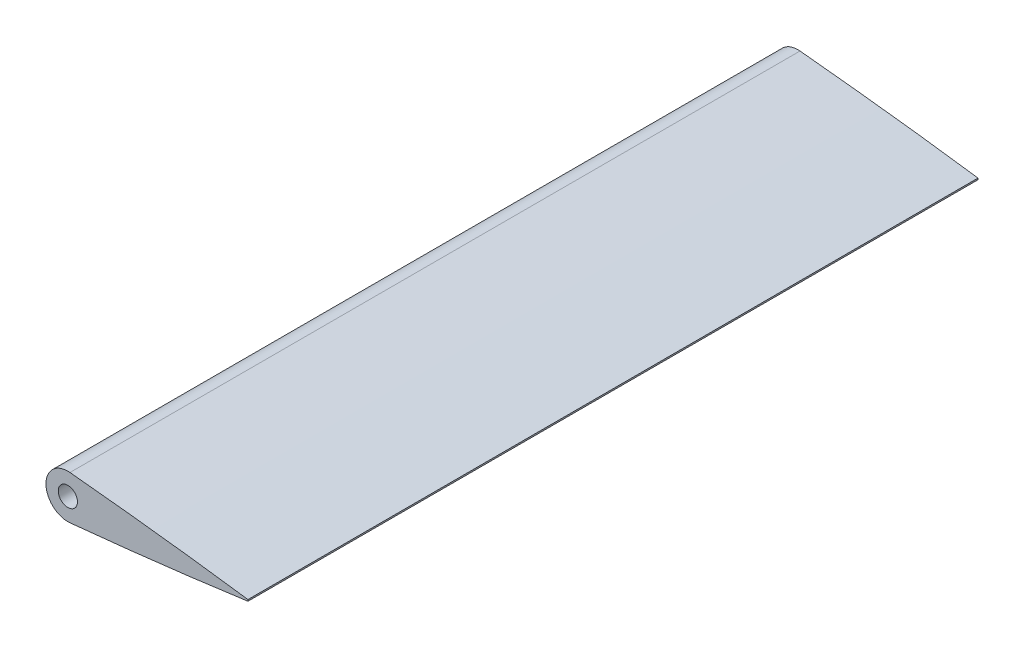
ISO-10303-21;
HEADER;
FILE_DESCRIPTION(('STEP AP214'),'2;1');
FILE_NAME('part.step','',(''),(''),'','','');
FILE_SCHEMA(('AUTOMOTIVE_DESIGN { 1 0 10303 214 1 1 1 1 }'));
ENDSEC;
DATA;
#1=APPLICATION_CONTEXT('core data for automotive mechanical design processes');
#2=APPLICATION_PROTOCOL_DEFINITION('international standard','automotive_design',2000,#1);
#3=PRODUCT_CONTEXT('',#1,'mechanical');
#4=PRODUCT('Part','Part','',(#3));
#5=PRODUCT_RELATED_PRODUCT_CATEGORY('part','',(#4));
#6=PRODUCT_DEFINITION_FORMATION('','',#4);
#7=PRODUCT_DEFINITION_CONTEXT('part definition',#1,'design');
#8=PRODUCT_DEFINITION('design','',#6,#7);
#9=PRODUCT_DEFINITION_SHAPE('','',#8);
#10=(LENGTH_UNIT() NAMED_UNIT(*) SI_UNIT(.MILLI.,.METRE.));
#11=(NAMED_UNIT(*) PLANE_ANGLE_UNIT() SI_UNIT($,.RADIAN.));
#12=(NAMED_UNIT(*) SI_UNIT($,.STERADIAN.) SOLID_ANGLE_UNIT());
#13=UNCERTAINTY_MEASURE_WITH_UNIT(LENGTH_MEASURE(1.E-05),#10,'distance_accuracy_value','');
#14=(GEOMETRIC_REPRESENTATION_CONTEXT(3) GLOBAL_UNCERTAINTY_ASSIGNED_CONTEXT((#13)) GLOBAL_UNIT_ASSIGNED_CONTEXT((#10,
#11,#12)) REPRESENTATION_CONTEXT('',''));
#15=CARTESIAN_POINT('',(0.,0.,0.));
#16=DIRECTION('',(0.,0.,1.));
#17=DIRECTION('',(1.,0.,0.));
#18=AXIS2_PLACEMENT_3D('',#15,#16,#17);
#19=CARTESIAN_POINT('',(175.,0.,0.));
#20=DIRECTION('',(1.,0.,0.));
#21=DIRECTION('',(0.,0.,-1.));
#22=AXIS2_PLACEMENT_3D('',#19,#20,#21);
#23=PLANE('',#22);
#24=DIRECTION('',(0.,-1.,0.));
#25=VECTOR('',#24,1.);
#26=CARTESIAN_POINT('',(175.,0.,140.));
#27=LINE('',#26,#25);
#28=CARTESIAN_POINT('',(175.,0.1575,140.));
#29=VERTEX_POINT('',#28);
#30=CARTESIAN_POINT('',(175.,-0.1575,140.));
#31=VERTEX_POINT('',#30);
#32=EDGE_CURVE('E100',#29,#31,#27,.T.);
#33=ORIENTED_EDGE('',*,*,#32,.F.);
#34=DIRECTION('',(0.,0.,-1.));
#35=VECTOR('',#34,1.);
#36=CARTESIAN_POINT('',(175.,0.1575,240.));
#37=LINE('',#36,#35);
#38=CARTESIAN_POINT('',(175.,0.1575,292.));
#39=VERTEX_POINT('',#38);
#40=EDGE_CURVE('E120',#39,#29,#37,.T.);
#41=ORIENTED_EDGE('',*,*,#40,.F.);
#42=CARTESIAN_POINT('',(175.,-0.1575,292.));
#43=DIRECTION('',(0.,1.,0.));
#44=VECTOR('',#43,1.);
#45=LINE('',#42,#44);
#46=CARTESIAN_POINT('',(175.,-0.1575,292.));
#47=VERTEX_POINT('',#46);
#48=EDGE_CURVE('E122',#47,#39,#45,.T.);
#49=ORIENTED_EDGE('',*,*,#48,.F.);
#50=DIRECTION('',(0.,0.,-1.));
#51=VECTOR('',#50,1.);
#52=CARTESIAN_POINT('',(175.,-0.1575,240.));
#53=LINE('',#52,#51);
#54=EDGE_CURVE('E86',#47,#31,#53,.T.);
#55=ORIENTED_EDGE('',*,*,#54,.T.);
#56=EDGE_LOOP('',(#33,#41,#49,#55));
#57=FACE_BOUND('',#56,.T.);
#58=ADVANCED_FACE('F75',(#57),#23,.T.);
#59=CARTESIAN_POINT('',(175.,0.1575,240.));
#60=CARTESIAN_POINT('',(174.975670099291,0.160914041541677,240.));
#61=CARTESIAN_POINT('',(174.878414868244,0.174561174873842,240.));
#62=CARTESIAN_POINT('',(174.659801499766,0.205159821362737,240.));
#63=CARTESIAN_POINT('',(173.814393736801,0.323268736827635,240.));
#64=CARTESIAN_POINT('',(171.971983222291,0.57756760983331,240.));
#65=CARTESIAN_POINT('',(169.804130316729,0.869468667880044,240.));
#66=CARTESIAN_POINT('',(167.798075845039,1.13373410035728,240.));
#67=CARTESIAN_POINT('',(166.331348146716,1.32444060697064,240.));
#68=CARTESIAN_POINT('',(161.322200966069,1.96622627689324,240.));
#69=CARTESIAN_POINT('',(156.013641601383,2.60401694235936,240.));
#70=CARTESIAN_POINT('',(149.576754994477,3.32818055621066,240.));
#71=CARTESIAN_POINT('',(145.376354095397,3.78430734567515,240.));
#72=CARTESIAN_POINT('',(140.114857130425,4.32702320742082,240.));
#73=CARTESIAN_POINT('',(134.595540648365,4.86377712086384,240.));
#74=CARTESIAN_POINT('',(129.857229802635,5.2939236206402,240.));
#75=CARTESIAN_POINT('',(124.980872811101,5.71026282365352,240.));
#76=CARTESIAN_POINT('',(120.0120690147,6.10561671430527,240.));
#77=CARTESIAN_POINT('',(115.012351702912,6.45951784353202,240.));
#78=CARTESIAN_POINT('',(109.989973527845,6.77673440530095,240.));
#79=CARTESIAN_POINT('',(105.979072501825,6.99718633343155,240.));
#80=CARTESIAN_POINT('',(101.986308858488,7.17846278877443,240.));
#81=CARTESIAN_POINT('',(99.0243670944716,7.29258098720803,240.));
#82=CARTESIAN_POINT('',(96.0938852893426,7.38375281774364,240.));
#83=CARTESIAN_POINT('',(93.2017061002433,7.45066565420669,240.));
#84=CARTESIAN_POINT('',(90.354579605028,7.49204060737605,240.));
#85=CARTESIAN_POINT('',(87.5591504088352,7.50675011459953,240.));
#86=CARTESIAN_POINT('',(84.8219466228125,7.49383510245646,240.));
#87=CARTESIAN_POINT('',(82.1493584308855,7.45253307987314,240.));
#88=CARTESIAN_POINT('',(79.5476260757768,7.38217851087511,240.));
#89=CARTESIAN_POINT('',(77.0228185580325,7.28242210028553,240.));
#90=CARTESIAN_POINT('',(74.5808316410772,7.15305057873661,240.));
#91=CARTESIAN_POINT('',(72.2273654371531,6.99404893787144,240.));
#92=CARTESIAN_POINT('',(69.9679051740815,6.80567273838647,240.));
#93=CARTESIAN_POINT('',(67.8077146053811,6.58837012507359,240.));
#94=CARTESIAN_POINT('',(65.7518313717883,6.34273624779991,240.));
#95=CARTESIAN_POINT('',(63.8050294111967,6.06966614435724,240.));
#96=CARTESIAN_POINT('',(61.9718426706377,5.77004523514184,240.));
#97=CARTESIAN_POINT('',(60.2564977921031,5.4451407514127,240.));
#98=CARTESIAN_POINT('',(58.6629613315306,5.09611834089171,240.));
#99=CARTESIAN_POINT('',(57.194862030039,4.72441172867768,240.));
#100=CARTESIAN_POINT('',(55.855529665828,4.33136969665917,240.));
#101=CARTESIAN_POINT('',(54.6479112309722,3.91848367818142,240.));
#102=CARTESIAN_POINT('',(53.5745877484243,3.48711742013033,240.));
#103=CARTESIAN_POINT('',(52.6376847429848,3.03857139047309,240.));
#104=CARTESIAN_POINT('',(51.8388647422435,2.57385454034864,240.));
#105=CARTESIAN_POINT('',(51.1792966032154,2.09350034520415,240.));
#106=CARTESIAN_POINT('',(50.6599476566587,1.59704066352714,240.));
#107=CARTESIAN_POINT('',(50.2824845062573,1.08274418879119,240.));
#108=CARTESIAN_POINT('',(50.0515051907536,0.548369702368575,240.));
#109=CARTESIAN_POINT('',(49.9748926745013,0.,240.));
#110=CARTESIAN_POINT('',(50.0515051907536,-0.548369702368577,240.));
#111=CARTESIAN_POINT('',(50.2824845062573,-1.08274418879117,240.));
#112=CARTESIAN_POINT('',(50.6599476566587,-1.59704066352716,240.));
#113=CARTESIAN_POINT('',(51.1792966032155,-2.09350034520413,240.));
#114=CARTESIAN_POINT('',(51.8388647422435,-2.57385454034865,240.));
#115=CARTESIAN_POINT('',(52.6376847429847,-3.03857139047308,240.));
#116=CARTESIAN_POINT('',(53.5745877484242,-3.48711742013034,240.));
#117=CARTESIAN_POINT('',(54.6479112309723,-3.91848367818143,240.));
#118=CARTESIAN_POINT('',(55.855529665828,-4.33136969665917,240.));
#119=CARTESIAN_POINT('',(57.194862030039,-4.72441172867768,240.));
#120=CARTESIAN_POINT('',(58.6629613315307,-5.09611834089171,240.));
#121=CARTESIAN_POINT('',(60.256497792103,-5.4451407514127,240.));
#122=CARTESIAN_POINT('',(61.9718426706377,-5.77004523514184,240.));
#123=CARTESIAN_POINT('',(63.8050294111967,-6.06966614435724,240.));
#124=CARTESIAN_POINT('',(65.7518313717883,-6.3427362477999,240.));
#125=CARTESIAN_POINT('',(67.8077146053812,-6.58837012507359,240.));
#126=CARTESIAN_POINT('',(69.9679051740815,-6.80567273838647,240.));
#127=CARTESIAN_POINT('',(72.2273654371531,-6.99404893787144,240.));
#128=CARTESIAN_POINT('',(74.5808316410772,-7.15305057873661,240.));
#129=CARTESIAN_POINT('',(77.0228185580326,-7.28242210028553,240.));
#130=CARTESIAN_POINT('',(79.5476260757768,-7.38217851087511,240.));
#131=CARTESIAN_POINT('',(82.1493584308855,-7.45253307987314,240.));
#132=CARTESIAN_POINT('',(84.8219466228125,-7.49383510245646,240.));
#133=CARTESIAN_POINT('',(87.5591504088352,-7.50675011459953,240.));
#134=CARTESIAN_POINT('',(90.3545796050281,-7.49204060737606,240.));
#135=CARTESIAN_POINT('',(93.2017061002433,-7.45066565420669,240.));
#136=CARTESIAN_POINT('',(96.0938852893426,-7.38375281774365,240.));
#137=CARTESIAN_POINT('',(99.0243670944716,-7.29258098720802,240.));
#138=CARTESIAN_POINT('',(101.986308858488,-7.17846278877443,240.));
#139=CARTESIAN_POINT('',(105.979072501825,-6.99718633343154,240.));
#140=CARTESIAN_POINT('',(109.989973527845,-6.77673440530096,240.));
#141=CARTESIAN_POINT('',(115.012351702912,-6.45951784353202,240.));
#142=CARTESIAN_POINT('',(120.012069394969,-6.1056154437259,240.));
#143=CARTESIAN_POINT('',(125.94642538828,-5.63343673309692,240.));
#144=CARTESIAN_POINT('',(130.822015497018,-5.20794437163472,240.));
#145=CARTESIAN_POINT('',(135.559592926317,-4.77002296948723,240.));
#146=CARTESIAN_POINT('',(140.957893319994,-4.24503729669465,240.));
#147=CARTESIAN_POINT('',(147.758819189274,-3.53419059637897,240.));
#148=CARTESIAN_POINT('',(155.953465965731,-2.61330750081689,240.));
#149=CARTESIAN_POINT('',(162.074632205995,-1.86982272355947,240.));
#150=CARTESIAN_POINT('',(166.331348146716,-1.32444060697065,240.));
#151=CARTESIAN_POINT('',(168.557587042106,-1.03498112303783,240.));
#152=CARTESIAN_POINT('',(170.827923989427,-0.732698223571853,240.));
#153=CARTESIAN_POINT('',(172.995190212219,-0.436495753077521,240.));
#154=CARTESIAN_POINT('',(174.078806920385,-0.286328510210598,240.));
#155=CARTESIAN_POINT('',(174.659801499766,-0.205159821362731,240.));
#156=CARTESIAN_POINT('',(174.878414868244,-0.174561174873843,240.));
#157=CARTESIAN_POINT('',(174.975670099291,-0.160914041541677,240.));
#158=CARTESIAN_POINT('',(175.,-0.1575,240.));
#159=B_SPLINE_CURVE_WITH_KNOTS('',3,(#59,#60,#61,#62,#63,#64,#65,#66,#67,#68,#69,#70,#71,#72,
#73,#74,#75,#76,#77,#78,#79,#80,#81,#82,#83,#84,#85,#86,#87,#88,#89,#90,#91,#92,#93,#94,#95,#96,
#97,#98,#99,#100,#101,#102,#103,#104,#105,#106,#107,#108,#109,#110,#111,#112,#113,#114,#115,
#116,#117,#118,#119,#120,#121,#122,#123,#124,#125,#126,#127,#128,#129,#130,#131,#132,#133,#134,
#135,#136,#137,#138,#139,#140,#141,#142,#143,#144,#145,#146,#147,#148,#149,#150,#151,#152,#153,
#154,#155,#156,#157,#158),.UNSPECIFIED.,.F.,.F.,(4,1,1,1,1,1,1,1,1,1,1,1,1,1,1,1,1,1,1,1,1,1,1,
1,1,1,1,1,1,1,1,1,1,1,1,1,1,1,1,1,1,1,1,1,1,1,1,1,1,1,1,1,1,1,1,1,1,1,1,1,1,1,1,1,1,1,1,1,1,1,1,
1,1,1,1,1,1,1,1,1,1,1,1,1,1,1,1,1,1,1,1,1,1,1,1,1,1,4),(0.,0.000289157089474186,
0.0011558633091664,0.00259805876717436,0.0103358462744863,0.0230457377742648,0.0283428836686461,
0.0341501483557849,0.0404537393346738,0.0877801023888762,0.0970773519152032,0.116690750020973,
0.137507311613728,0.159331021819007,0.181956667595326,0.193504001733211,0.21693215026303,
0.24062147148056,0.252494877562422,0.276160723248583,0.287898269502264,0.299535917539716,
0.311046970510736,0.322405027863275,0.333584243393343,0.344559419732818,0.355305879102253,
0.365799644675589,0.376017645463572,0.385937517863606,0.395537813641388,0.404798066410151,
0.41369880992526,0.422221683237475,0.430349464839536,0.438066152610253,0.445357160907796,
0.452209437176443,0.458611487663545,0.464554011593151,0.470029939859423,0.475035092647181,
0.479569168875679,0.483636928018542,0.487250234247951,0.490431505137214,0.493218859081049,
0.495674082647599,0.497891237495517,0.5,0.502108762504483,0.504325917352401,0.50678114091895,
0.509568494862786,0.512749765752048,0.516363071981458,0.520430831124321,0.524964907352819,
0.529970060140576,0.535445988406849,0.541388512336455,0.547790562823557,0.554642839092204,
0.561933847389747,0.569650535160464,0.577778316762525,0.58630119007474,0.595201933589849,
0.604462186358612,0.614062482136394,0.623982354536427,0.634200355324411,0.644694120897747,
0.655440580267181,0.666415756606657,0.677594972136725,0.688953029489264,0.700464082460284,
0.712101730497736,0.723839276751416,0.747505122437578,0.75937852851944,0.78306784973697,
0.806495998266789,0.829443250621851,0.840668978180993,0.862492688386272,0.893278152539754,
0.921148048165806,0.959546260665326,0.965849851644215,0.971657116331354,0.985968595369371,
0.99280639725374,0.997401941232826,0.998844136690833,0.999710842910526,1.),.UNSPECIFIED.);
#160=DIRECTION('',(0.,0.,-1.));
#161=VECTOR('',#160,1.);
#162=SURFACE_OF_LINEAR_EXTRUSION('',#159,#161);
#163=CARTESIAN_POINT('',(175.,0.1575,140.));
#164=CARTESIAN_POINT('',(174.975670099291,0.160914041541677,140.));
#165=CARTESIAN_POINT('',(174.878414868244,0.174561174873842,140.));
#166=CARTESIAN_POINT('',(174.659801499766,0.205159821362737,140.));
#167=CARTESIAN_POINT('',(173.814393736801,0.323268736827635,140.));
#168=CARTESIAN_POINT('',(171.971983222291,0.57756760983331,140.));
#169=CARTESIAN_POINT('',(169.804130316729,0.869468667880044,140.));
#170=CARTESIAN_POINT('',(167.798075845039,1.13373410035728,140.));
#171=CARTESIAN_POINT('',(166.331348146716,1.32444060697064,140.));
#172=CARTESIAN_POINT('',(161.322200966069,1.96622627689324,140.));
#173=CARTESIAN_POINT('',(156.013641601383,2.60401694235936,140.));
#174=CARTESIAN_POINT('',(149.576754994477,3.32818055621066,140.));
#175=CARTESIAN_POINT('',(145.376354095397,3.78430734567515,140.));
#176=CARTESIAN_POINT('',(140.114857130425,4.32702320742082,140.));
#177=CARTESIAN_POINT('',(134.595540648365,4.86377712086384,140.));
#178=CARTESIAN_POINT('',(129.857229802635,5.2939236206402,140.));
#179=CARTESIAN_POINT('',(124.980872811101,5.71026282365352,140.));
#180=CARTESIAN_POINT('',(120.0120690147,6.10561671430527,140.));
#181=CARTESIAN_POINT('',(115.012351702912,6.45951784353202,140.));
#182=CARTESIAN_POINT('',(109.989973527845,6.77673440530095,140.));
#183=CARTESIAN_POINT('',(105.979072501825,6.99718633343155,140.));
#184=CARTESIAN_POINT('',(101.986308858488,7.17846278877443,140.));
#185=CARTESIAN_POINT('',(99.0243670944716,7.29258098720803,140.));
#186=CARTESIAN_POINT('',(96.0938852893426,7.38375281774364,140.));
#187=CARTESIAN_POINT('',(93.2017061002433,7.45066565420669,140.));
#188=CARTESIAN_POINT('',(90.354579605028,7.49204060737605,140.));
#189=CARTESIAN_POINT('',(87.5591504088352,7.50675011459953,140.));
#190=CARTESIAN_POINT('',(84.8219466228125,7.49383510245646,140.));
#191=CARTESIAN_POINT('',(82.1493584308855,7.45253307987314,140.));
#192=CARTESIAN_POINT('',(79.5476260757768,7.38217851087511,140.));
#193=CARTESIAN_POINT('',(77.0228185580325,7.28242210028553,140.));
#194=CARTESIAN_POINT('',(74.5808316410772,7.15305057873661,140.));
#195=CARTESIAN_POINT('',(72.2273654371531,6.99404893787144,140.));
#196=CARTESIAN_POINT('',(69.9679051740815,6.80567273838647,140.));
#197=CARTESIAN_POINT('',(67.8077146053811,6.58837012507359,140.));
#198=CARTESIAN_POINT('',(65.7518313717883,6.34273624779991,140.));
#199=CARTESIAN_POINT('',(63.8050294111967,6.06966614435724,140.));
#200=CARTESIAN_POINT('',(61.9718426706377,5.77004523514184,140.));
#201=CARTESIAN_POINT('',(60.2564977921031,5.4451407514127,140.));
#202=CARTESIAN_POINT('',(58.6629613315306,5.09611834089171,140.));
#203=CARTESIAN_POINT('',(57.194862030039,4.72441172867768,140.));
#204=CARTESIAN_POINT('',(55.855529665828,4.33136969665917,140.));
#205=CARTESIAN_POINT('',(54.6479112309722,3.91848367818142,140.));
#206=CARTESIAN_POINT('',(53.5745877484243,3.48711742013033,140.));
#207=CARTESIAN_POINT('',(52.6376847429848,3.03857139047309,140.));
#208=CARTESIAN_POINT('',(51.8388647422435,2.57385454034864,140.));
#209=CARTESIAN_POINT('',(51.1792966032154,2.09350034520415,140.));
#210=CARTESIAN_POINT('',(50.6599476566587,1.59704066352714,140.));
#211=CARTESIAN_POINT('',(50.2824845062573,1.08274418879119,140.));
#212=CARTESIAN_POINT('',(50.0515051907536,0.548369702368575,140.));
#213=CARTESIAN_POINT('',(49.9748926745013,0.,140.));
#214=CARTESIAN_POINT('',(50.0515051907536,-0.548369702368577,140.));
#215=CARTESIAN_POINT('',(50.2824845062573,-1.08274418879117,140.));
#216=CARTESIAN_POINT('',(50.6599476566587,-1.59704066352716,140.));
#217=CARTESIAN_POINT('',(51.1792966032155,-2.09350034520413,140.));
#218=CARTESIAN_POINT('',(51.8388647422435,-2.57385454034865,140.));
#219=CARTESIAN_POINT('',(52.6376847429847,-3.03857139047308,140.));
#220=CARTESIAN_POINT('',(53.5745877484242,-3.48711742013034,140.));
#221=CARTESIAN_POINT('',(54.6479112309723,-3.91848367818143,140.));
#222=CARTESIAN_POINT('',(55.855529665828,-4.33136969665917,140.));
#223=CARTESIAN_POINT('',(57.194862030039,-4.72441172867768,140.));
#224=CARTESIAN_POINT('',(58.6629613315307,-5.09611834089171,140.));
#225=CARTESIAN_POINT('',(60.256497792103,-5.4451407514127,140.));
#226=CARTESIAN_POINT('',(61.9718426706377,-5.77004523514184,140.));
#227=CARTESIAN_POINT('',(63.8050294111967,-6.06966614435724,140.));
#228=CARTESIAN_POINT('',(65.7518313717883,-6.3427362477999,140.));
#229=CARTESIAN_POINT('',(67.8077146053812,-6.58837012507359,140.));
#230=CARTESIAN_POINT('',(69.9679051740815,-6.80567273838647,140.));
#231=CARTESIAN_POINT('',(72.2273654371531,-6.99404893787144,140.));
#232=CARTESIAN_POINT('',(74.5808316410772,-7.15305057873661,140.));
#233=CARTESIAN_POINT('',(77.0228185580326,-7.28242210028553,140.));
#234=CARTESIAN_POINT('',(79.5476260757768,-7.38217851087511,140.));
#235=CARTESIAN_POINT('',(82.1493584308855,-7.45253307987314,140.));
#236=CARTESIAN_POINT('',(84.8219466228125,-7.49383510245646,140.));
#237=CARTESIAN_POINT('',(87.5591504088352,-7.50675011459953,140.));
#238=CARTESIAN_POINT('',(90.3545796050281,-7.49204060737606,140.));
#239=CARTESIAN_POINT('',(93.2017061002433,-7.45066565420669,140.));
#240=CARTESIAN_POINT('',(96.0938852893426,-7.38375281774365,140.));
#241=CARTESIAN_POINT('',(99.0243670944716,-7.29258098720802,140.));
#242=CARTESIAN_POINT('',(101.986308858488,-7.17846278877443,140.));
#243=CARTESIAN_POINT('',(105.979072501825,-6.99718633343154,140.));
#244=CARTESIAN_POINT('',(109.989973527845,-6.77673440530096,140.));
#245=CARTESIAN_POINT('',(115.012351702912,-6.45951784353202,140.));
#246=CARTESIAN_POINT('',(120.012069394969,-6.1056154437259,140.));
#247=CARTESIAN_POINT('',(125.94642538828,-5.63343673309692,140.));
#248=CARTESIAN_POINT('',(130.822015497018,-5.20794437163472,140.));
#249=CARTESIAN_POINT('',(135.559592926317,-4.77002296948723,140.));
#250=CARTESIAN_POINT('',(140.957893319994,-4.24503729669465,140.));
#251=CARTESIAN_POINT('',(147.758819189274,-3.53419059637897,140.));
#252=CARTESIAN_POINT('',(155.953465965731,-2.61330750081689,140.));
#253=CARTESIAN_POINT('',(162.074632205995,-1.86982272355947,140.));
#254=CARTESIAN_POINT('',(166.331348146716,-1.32444060697065,140.));
#255=CARTESIAN_POINT('',(168.557587042106,-1.03498112303783,140.));
#256=CARTESIAN_POINT('',(170.827923989427,-0.732698223571853,140.));
#257=CARTESIAN_POINT('',(172.995190212219,-0.436495753077521,140.));
#258=CARTESIAN_POINT('',(174.078806920385,-0.286328510210598,140.));
#259=CARTESIAN_POINT('',(174.659801499766,-0.205159821362731,140.));
#260=CARTESIAN_POINT('',(174.878414868244,-0.174561174873843,140.));
#261=CARTESIAN_POINT('',(174.975670099291,-0.160914041541677,140.));
#262=CARTESIAN_POINT('',(175.,-0.1575,140.));
#263=B_SPLINE_CURVE_WITH_KNOTS('',3,(#163,#164,#165,#166,#167,#168,#169,#170,#171,#172,#173,
#174,#175,#176,#177,#178,#179,#180,#181,#182,#183,#184,#185,#186,#187,#188,#189,#190,#191,#192,
#193,#194,#195,#196,#197,#198,#199,#200,#201,#202,#203,#204,#205,#206,#207,#208,#209,#210,#211,
#212,#213,#214,#215,#216,#217,#218,#219,#220,#221,#222,#223,#224,#225,#226,#227,#228,#229,#230,
#231,#232,#233,#234,#235,#236,#237,#238,#239,#240,#241,#242,#243,#244,#245,#246,#247,#248,#249,
#250,#251,#252,#253,#254,#255,#256,#257,#258,#259,#260,#261,#262),.UNSPECIFIED.,.F.,.F.,(4,1,1,
1,1,1,1,1,1,1,1,1,1,1,1,1,1,1,1,1,1,1,1,1,1,1,1,1,1,1,1,1,1,1,1,1,1,1,1,1,1,1,1,1,1,1,1,1,1,1,1,
1,1,1,1,1,1,1,1,1,1,1,1,1,1,1,1,1,1,1,1,1,1,1,1,1,1,1,1,1,1,1,1,1,1,1,1,1,1,1,1,1,1,1,1,1,1,4),
(0.,0.000289157089474186,0.0011558633091664,0.00259805876717436,0.0103358462744863,
0.0230457377742648,0.0283428836686461,0.0341501483557849,0.0404537393346738,0.0877801023888762,
0.0970773519152032,0.116690750020973,0.137507311613728,0.159331021819007,0.181956667595326,
0.193504001733211,0.21693215026303,0.24062147148056,0.252494877562422,0.276160723248583,
0.287898269502264,0.299535917539716,0.311046970510736,0.322405027863275,0.333584243393343,
0.344559419732818,0.355305879102253,0.365799644675589,0.376017645463572,0.385937517863606,
0.395537813641388,0.404798066410151,0.41369880992526,0.422221683237475,0.430349464839536,
0.438066152610253,0.445357160907796,0.452209437176443,0.458611487663545,0.464554011593151,
0.470029939859423,0.475035092647181,0.479569168875679,0.483636928018542,0.487250234247951,
0.490431505137214,0.493218859081049,0.495674082647599,0.497891237495517,0.5,0.502108762504483,
0.504325917352401,0.50678114091895,0.509568494862786,0.512749765752048,0.516363071981458,
0.520430831124321,0.524964907352819,0.529970060140576,0.535445988406849,0.541388512336455,
0.547790562823557,0.554642839092204,0.561933847389747,0.569650535160464,0.577778316762525,
0.58630119007474,0.595201933589849,0.604462186358612,0.614062482136394,0.623982354536427,
0.634200355324411,0.644694120897747,0.655440580267181,0.666415756606657,0.677594972136725,
0.688953029489264,0.700464082460284,0.712101730497736,0.723839276751416,0.747505122437578,
0.75937852851944,0.78306784973697,0.806495998266789,0.829443250621851,0.840668978180993,
0.862492688386272,0.893278152539754,0.921148048165806,0.959546260665326,0.965849851644215,
0.971657116331354,0.985968595369371,0.99280639725374,0.997401941232826,0.998844136690833,
0.999710842910526,1.),.UNSPECIFIED.);
#264=CARTESIAN_POINT('',(137.943583597245,-4.53662744899246,140.));
#265=VERTEX_POINT('',#264);
#266=EDGE_CURVE('E94',#265,#31,#263,.T.);
#267=ORIENTED_EDGE('',*,*,#266,.T.);
#268=ORIENTED_EDGE('',*,*,#54,.F.);
#269=CARTESIAN_POINT('',(175.,-0.1575,292.));
#270=CARTESIAN_POINT('',(174.975670099291,-0.160914041541677,292.));
#271=CARTESIAN_POINT('',(174.878414868244,-0.174561174873843,292.));
#272=CARTESIAN_POINT('',(174.659801499766,-0.205159821362731,292.));
#273=CARTESIAN_POINT('',(174.078806920385,-0.286328510210598,292.));
#274=CARTESIAN_POINT('',(172.995190212219,-0.436495753077521,292.));
#275=CARTESIAN_POINT('',(170.827923989427,-0.732698223571853,292.));
#276=CARTESIAN_POINT('',(168.557587042106,-1.03498112303783,292.));
#277=CARTESIAN_POINT('',(166.331348146716,-1.32444060697065,292.));
#278=CARTESIAN_POINT('',(162.074632205995,-1.86982272355947,292.));
#279=CARTESIAN_POINT('',(155.953465965731,-2.61330750081689,292.));
#280=CARTESIAN_POINT('',(147.758819189274,-3.53419059637897,292.));
#281=CARTESIAN_POINT('',(142.050565741615,-4.13082893736768,292.));
#282=CARTESIAN_POINT('',(138.695644646101,-4.46308848456144,292.));
#283=CARTESIAN_POINT('',(137.94359190283,-4.53662433040611,292.));
#284=B_SPLINE_CURVE_WITH_KNOTS('',3,(#269,#270,#271,#272,#273,#274,#275,#276,#277,#278,#279,
#280,#281,#282,#283),.UNSPECIFIED.,.F.,.F.,(4,1,1,1,1,1,1,1,1,1,1,1,4),(0.853599167684642,
0.853888324774116,0.854755030993808,0.856197226451816,0.860792770430902,0.867630572315271,
0.881942051353288,0.887749316040427,0.894052907019316,0.932451119518836,0.960321015144888,
0.99110647929837,1.),.UNSPECIFIED.);
#285=CARTESIAN_POINT('',(137.94359190283,-4.53662433040611,292.));
#286=VERTEX_POINT('',#285);
#287=EDGE_CURVE('E139',#286,#47,#284,.F.);
#288=ORIENTED_EDGE('',*,*,#287,.F.);
#289=DIRECTION('',(0.,0.,-1.));
#290=VECTOR('',#289,1.);
#291=CARTESIAN_POINT('',(137.943591877889,-4.5366240753357,240.));
#292=LINE('',#291,#290);
#293=EDGE_CURVE('E189',#286,#265,#292,.T.);
#294=ORIENTED_EDGE('',*,*,#293,.T.);
#295=EDGE_LOOP('',(#267,#268,#288,#294));
#296=FACE_BOUND('',#295,.T.);
#297=ADVANCED_FACE('F165',(#296),#162,.F.);
#298=CARTESIAN_POINT('',(175.,0.1575,240.));
#299=CARTESIAN_POINT('',(174.975670099291,0.160914041541677,240.));
#300=CARTESIAN_POINT('',(174.878414868244,0.174561174873842,240.));
#301=CARTESIAN_POINT('',(174.659801499766,0.205159821362737,240.));
#302=CARTESIAN_POINT('',(173.814393736801,0.323268736827635,240.));
#303=CARTESIAN_POINT('',(171.971983222291,0.57756760983331,240.));
#304=CARTESIAN_POINT('',(169.804130316729,0.869468667880044,240.));
#305=CARTESIAN_POINT('',(167.798075845039,1.13373410035728,240.));
#306=CARTESIAN_POINT('',(166.331348146716,1.32444060697064,240.));
#307=CARTESIAN_POINT('',(161.322200966069,1.96622627689324,240.));
#308=CARTESIAN_POINT('',(156.013641601383,2.60401694235936,240.));
#309=CARTESIAN_POINT('',(149.576754994477,3.32818055621066,240.));
#310=CARTESIAN_POINT('',(145.376354095397,3.78430734567515,240.));
#311=CARTESIAN_POINT('',(140.114857130425,4.32702320742082,240.));
#312=CARTESIAN_POINT('',(134.595540648365,4.86377712086384,240.));
#313=CARTESIAN_POINT('',(129.857229802635,5.2939236206402,240.));
#314=CARTESIAN_POINT('',(124.980872811101,5.71026282365352,240.));
#315=CARTESIAN_POINT('',(120.0120690147,6.10561671430527,240.));
#316=CARTESIAN_POINT('',(115.012351702912,6.45951784353202,240.));
#317=CARTESIAN_POINT('',(109.989973527845,6.77673440530095,240.));
#318=CARTESIAN_POINT('',(105.979072501825,6.99718633343155,240.));
#319=CARTESIAN_POINT('',(101.986308858488,7.17846278877443,240.));
#320=CARTESIAN_POINT('',(99.0243670944716,7.29258098720803,240.));
#321=CARTESIAN_POINT('',(96.0938852893426,7.38375281774364,240.));
#322=CARTESIAN_POINT('',(93.2017061002433,7.45066565420669,240.));
#323=CARTESIAN_POINT('',(90.354579605028,7.49204060737605,240.));
#324=CARTESIAN_POINT('',(87.5591504088352,7.50675011459953,240.));
#325=CARTESIAN_POINT('',(84.8219466228125,7.49383510245646,240.));
#326=CARTESIAN_POINT('',(82.1493584308855,7.45253307987314,240.));
#327=CARTESIAN_POINT('',(79.5476260757768,7.38217851087511,240.));
#328=CARTESIAN_POINT('',(77.0228185580325,7.28242210028553,240.));
#329=CARTESIAN_POINT('',(74.5808316410772,7.15305057873661,240.));
#330=CARTESIAN_POINT('',(72.2273654371531,6.99404893787144,240.));
#331=CARTESIAN_POINT('',(69.9679051740815,6.80567273838647,240.));
#332=CARTESIAN_POINT('',(67.8077146053811,6.58837012507359,240.));
#333=CARTESIAN_POINT('',(65.7518313717883,6.34273624779991,240.));
#334=CARTESIAN_POINT('',(63.8050294111967,6.06966614435724,240.));
#335=CARTESIAN_POINT('',(61.9718426706377,5.77004523514184,240.));
#336=CARTESIAN_POINT('',(60.2564977921031,5.4451407514127,240.));
#337=CARTESIAN_POINT('',(58.6629613315306,5.09611834089171,240.));
#338=CARTESIAN_POINT('',(57.194862030039,4.72441172867768,240.));
#339=CARTESIAN_POINT('',(55.855529665828,4.33136969665917,240.));
#340=CARTESIAN_POINT('',(54.6479112309722,3.91848367818142,240.));
#341=CARTESIAN_POINT('',(53.5745877484243,3.48711742013033,240.));
#342=CARTESIAN_POINT('',(52.6376847429848,3.03857139047309,240.));
#343=CARTESIAN_POINT('',(51.8388647422435,2.57385454034864,240.));
#344=CARTESIAN_POINT('',(51.1792966032154,2.09350034520415,240.));
#345=CARTESIAN_POINT('',(50.6599476566587,1.59704066352714,240.));
#346=CARTESIAN_POINT('',(50.2824845062573,1.08274418879119,240.));
#347=CARTESIAN_POINT('',(50.0515051907536,0.548369702368575,240.));
#348=CARTESIAN_POINT('',(49.9748926745013,0.,240.));
#349=CARTESIAN_POINT('',(50.0515051907536,-0.548369702368577,240.));
#350=CARTESIAN_POINT('',(50.2824845062573,-1.08274418879117,240.));
#351=CARTESIAN_POINT('',(50.6599476566587,-1.59704066352716,240.));
#352=CARTESIAN_POINT('',(51.1792966032155,-2.09350034520413,240.));
#353=CARTESIAN_POINT('',(51.8388647422435,-2.57385454034865,240.));
#354=CARTESIAN_POINT('',(52.6376847429847,-3.03857139047308,240.));
#355=CARTESIAN_POINT('',(53.5745877484242,-3.48711742013034,240.));
#356=CARTESIAN_POINT('',(54.6479112309723,-3.91848367818143,240.));
#357=CARTESIAN_POINT('',(55.855529665828,-4.33136969665917,240.));
#358=CARTESIAN_POINT('',(57.194862030039,-4.72441172867768,240.));
#359=CARTESIAN_POINT('',(58.6629613315307,-5.09611834089171,240.));
#360=CARTESIAN_POINT('',(60.256497792103,-5.4451407514127,240.));
#361=CARTESIAN_POINT('',(61.9718426706377,-5.77004523514184,240.));
#362=CARTESIAN_POINT('',(63.8050294111967,-6.06966614435724,240.));
#363=CARTESIAN_POINT('',(65.7518313717883,-6.3427362477999,240.));
#364=CARTESIAN_POINT('',(67.8077146053812,-6.58837012507359,240.));
#365=CARTESIAN_POINT('',(69.9679051740815,-6.80567273838647,240.));
#366=CARTESIAN_POINT('',(72.2273654371531,-6.99404893787144,240.));
#367=CARTESIAN_POINT('',(74.5808316410772,-7.15305057873661,240.));
#368=CARTESIAN_POINT('',(77.0228185580326,-7.28242210028553,240.));
#369=CARTESIAN_POINT('',(79.5476260757768,-7.38217851087511,240.));
#370=CARTESIAN_POINT('',(82.1493584308855,-7.45253307987314,240.));
#371=CARTESIAN_POINT('',(84.8219466228125,-7.49383510245646,240.));
#372=CARTESIAN_POINT('',(87.5591504088352,-7.50675011459953,240.));
#373=CARTESIAN_POINT('',(90.3545796050281,-7.49204060737606,240.));
#374=CARTESIAN_POINT('',(93.2017061002433,-7.45066565420669,240.));
#375=CARTESIAN_POINT('',(96.0938852893426,-7.38375281774365,240.));
#376=CARTESIAN_POINT('',(99.0243670944716,-7.29258098720802,240.));
#377=CARTESIAN_POINT('',(101.986308858488,-7.17846278877443,240.));
#378=CARTESIAN_POINT('',(105.979072501825,-6.99718633343154,240.));
#379=CARTESIAN_POINT('',(109.989973527845,-6.77673440530096,240.));
#380=CARTESIAN_POINT('',(115.012351702912,-6.45951784353202,240.));
#381=CARTESIAN_POINT('',(120.012069394969,-6.1056154437259,240.));
#382=CARTESIAN_POINT('',(125.94642538828,-5.63343673309692,240.));
#383=CARTESIAN_POINT('',(130.822015497018,-5.20794437163472,240.));
#384=CARTESIAN_POINT('',(135.559592926317,-4.77002296948723,240.));
#385=CARTESIAN_POINT('',(140.957893319994,-4.24503729669465,240.));
#386=CARTESIAN_POINT('',(147.758819189274,-3.53419059637897,240.));
#387=CARTESIAN_POINT('',(155.953465965731,-2.61330750081689,240.));
#388=CARTESIAN_POINT('',(162.074632205995,-1.86982272355947,240.));
#389=CARTESIAN_POINT('',(166.331348146716,-1.32444060697065,240.));
#390=CARTESIAN_POINT('',(168.557587042106,-1.03498112303783,240.));
#391=CARTESIAN_POINT('',(170.827923989427,-0.732698223571853,240.));
#392=CARTESIAN_POINT('',(172.995190212219,-0.436495753077521,240.));
#393=CARTESIAN_POINT('',(174.078806920385,-0.286328510210598,240.));
#394=CARTESIAN_POINT('',(174.659801499766,-0.205159821362731,240.));
#395=CARTESIAN_POINT('',(174.878414868244,-0.174561174873843,240.));
#396=CARTESIAN_POINT('',(174.975670099291,-0.160914041541677,240.));
#397=CARTESIAN_POINT('',(175.,-0.1575,240.));
#398=B_SPLINE_CURVE_WITH_KNOTS('',3,(#298,#299,#300,#301,#302,#303,#304,#305,#306,#307,#308,
#309,#310,#311,#312,#313,#314,#315,#316,#317,#318,#319,#320,#321,#322,#323,#324,#325,#326,#327,
#328,#329,#330,#331,#332,#333,#334,#335,#336,#337,#338,#339,#340,#341,#342,#343,#344,#345,#346,
#347,#348,#349,#350,#351,#352,#353,#354,#355,#356,#357,#358,#359,#360,#361,#362,#363,#364,#365,
#366,#367,#368,#369,#370,#371,#372,#373,#374,#375,#376,#377,#378,#379,#380,#381,#382,#383,#384,
#385,#386,#387,#388,#389,#390,#391,#392,#393,#394,#395,#396,#397),.UNSPECIFIED.,.F.,.F.,(4,1,1,
1,1,1,1,1,1,1,1,1,1,1,1,1,1,1,1,1,1,1,1,1,1,1,1,1,1,1,1,1,1,1,1,1,1,1,1,1,1,1,1,1,1,1,1,1,1,1,1,
1,1,1,1,1,1,1,1,1,1,1,1,1,1,1,1,1,1,1,1,1,1,1,1,1,1,1,1,1,1,1,1,1,1,1,1,1,1,1,1,1,1,1,1,1,1,4),
(0.,0.000289157089474186,0.0011558633091664,0.00259805876717436,0.0103358462744863,
0.0230457377742648,0.0283428836686461,0.0341501483557849,0.0404537393346738,0.0877801023888762,
0.0970773519152032,0.116690750020973,0.137507311613728,0.159331021819007,0.181956667595326,
0.193504001733211,0.21693215026303,0.24062147148056,0.252494877562422,0.276160723248583,
0.287898269502264,0.299535917539716,0.311046970510736,0.322405027863275,0.333584243393343,
0.344559419732818,0.355305879102253,0.365799644675589,0.376017645463572,0.385937517863606,
0.395537813641388,0.404798066410151,0.41369880992526,0.422221683237475,0.430349464839536,
0.438066152610253,0.445357160907796,0.452209437176443,0.458611487663545,0.464554011593151,
0.470029939859423,0.475035092647181,0.479569168875679,0.483636928018542,0.487250234247951,
0.490431505137214,0.493218859081049,0.495674082647599,0.497891237495517,0.5,0.502108762504483,
0.504325917352401,0.50678114091895,0.509568494862786,0.512749765752048,0.516363071981458,
0.520430831124321,0.524964907352819,0.529970060140576,0.535445988406849,0.541388512336455,
0.547790562823557,0.554642839092204,0.561933847389747,0.569650535160464,0.577778316762525,
0.58630119007474,0.595201933589849,0.604462186358612,0.614062482136394,0.623982354536427,
0.634200355324411,0.644694120897747,0.655440580267181,0.666415756606657,0.677594972136725,
0.688953029489264,0.700464082460284,0.712101730497736,0.723839276751416,0.747505122437578,
0.75937852851944,0.78306784973697,0.806495998266789,0.829443250621851,0.840668978180993,
0.862492688386272,0.893278152539754,0.921148048165806,0.959546260665326,0.965849851644215,
0.971657116331354,0.985968595369371,0.99280639725374,0.997401941232826,0.998844136690833,
0.999710842910526,1.),.UNSPECIFIED.);
#399=DIRECTION('',(0.,0.,-1.));
#400=VECTOR('',#399,1.);
#401=SURFACE_OF_LINEAR_EXTRUSION('',#398,#400);
#402=CARTESIAN_POINT('',(137.943587645398,4.53662423167826,140.));
#403=VERTEX_POINT('',#402);
#404=EDGE_CURVE('E12',#29,#403,#263,.T.);
#405=ORIENTED_EDGE('',*,*,#404,.T.);
#406=DIRECTION('',(0.,0.,-1.));
#407=VECTOR('',#406,1.);
#408=CARTESIAN_POINT('',(137.943597424835,4.53662327544175,240.));
#409=LINE('',#408,#407);
#410=CARTESIAN_POINT('',(137.943597424835,4.53662327544174,292.));
#411=VERTEX_POINT('',#410);
#412=EDGE_CURVE('E127',#411,#403,#409,.T.);
#413=ORIENTED_EDGE('',*,*,#412,.F.);
#414=CARTESIAN_POINT('',(137.943597424835,4.53662327544175,292.));
#415=CARTESIAN_POINT('',(138.695648222186,4.46308668736837,292.));
#416=CARTESIAN_POINT('',(141.207680564955,4.21430003833891,292.));
#417=CARTESIAN_POINT('',(145.376354095397,3.78430734567515,292.));
#418=CARTESIAN_POINT('',(149.576754994477,3.32818055621066,292.));
#419=CARTESIAN_POINT('',(156.013641601383,2.60401694235936,292.));
#420=CARTESIAN_POINT('',(161.322200966069,1.96622627689324,292.));
#421=CARTESIAN_POINT('',(166.331348146716,1.32444060697064,292.));
#422=CARTESIAN_POINT('',(167.798075845039,1.13373410035728,292.));
#423=CARTESIAN_POINT('',(169.804130316729,0.869468667880044,292.));
#424=CARTESIAN_POINT('',(171.971983222291,0.57756760983331,292.));
#425=CARTESIAN_POINT('',(173.814393736801,0.323268736827635,292.));
#426=CARTESIAN_POINT('',(174.659801499766,0.205159821362737,292.));
#427=CARTESIAN_POINT('',(174.878414868244,0.174561174873842,292.));
#428=CARTESIAN_POINT('',(174.975670099291,0.160914041541677,292.));
#429=CARTESIAN_POINT('',(175.,0.1575,292.));
#430=B_SPLINE_CURVE_WITH_KNOTS('',3,(#414,#415,#416,#417,#418,#419,#420,#421,#422,#423,#424,
#425,#426,#427,#428,#429),.UNSPECIFIED.,.F.,.F.,(4,1,1,1,1,1,1,1,1,1,1,1,1,4),(0.,
0.00889349855463092,0.029710060147386,0.0493234582531559,0.0586207077794829,0.105947070833685,
0.112250661812574,0.118057926499713,0.123355072394094,0.136064963893873,0.143802751401185,
0.145244946859193,0.146111653078885,0.146400810168359),.UNSPECIFIED.);
#431=EDGE_CURVE('E135',#39,#411,#430,.F.);
#432=ORIENTED_EDGE('',*,*,#431,.F.);
#433=ORIENTED_EDGE('',*,*,#40,.T.);
#434=EDGE_LOOP('',(#405,#413,#432,#433));
#435=FACE_BOUND('',#434,.T.);
#436=ADVANCED_FACE('F145',(#435),#401,.F.);
#437=CARTESIAN_POINT('',(137.5,0.,240.));
#438=DIRECTION('',(0.,0.,-1.));
#439=DIRECTION('',(-1.,0.,0.));
#440=AXIS2_PLACEMENT_3D('',#437,#438,#439);
#441=CYLINDRICAL_SURFACE('',#440,4.55825947249608);
#442=CARTESIAN_POINT('',(137.5,0.,140.));
#443=DIRECTION('',(0.,0.,1.));
#444=DIRECTION('',(1.,0.,0.));
#445=AXIS2_PLACEMENT_3D('',#442,#443,#444);
#446=CIRCLE('',#445,4.55825947249608);
#447=EDGE_CURVE('E196',#403,#265,#446,.T.);
#448=ORIENTED_EDGE('',*,*,#447,.T.);
#449=ORIENTED_EDGE('',*,*,#293,.F.);
#450=CARTESIAN_POINT('',(137.5,0.,292.));
#451=DIRECTION('',(0.,0.,1.));
#452=DIRECTION('',(1.,0.,0.));
#453=AXIS2_PLACEMENT_3D('',#450,#451,#452);
#454=CIRCLE('',#453,4.55825947249608);
#455=EDGE_CURVE('E236',#411,#286,#454,.T.);
#456=ORIENTED_EDGE('',*,*,#455,.F.);
#457=ORIENTED_EDGE('',*,*,#412,.T.);
#458=EDGE_LOOP('',(#448,#449,#456,#457));
#459=FACE_BOUND('',#458,.T.);
#460=ADVANCED_FACE('F164',(#459),#441,.T.);
#461=CARTESIAN_POINT('',(137.5,0.,240.));
#462=DIRECTION('',(0.,0.,-1.));
#463=DIRECTION('',(-1.,0.,0.));
#464=AXIS2_PLACEMENT_3D('',#461,#462,#463);
#465=CYLINDRICAL_SURFACE('',#464,2.);
#466=CARTESIAN_POINT('',(137.5,0.,140.));
#467=DIRECTION('',(0.,0.,1.));
#468=DIRECTION('',(1.,0.,0.));
#469=AXIS2_PLACEMENT_3D('',#466,#467,#468);
#470=CIRCLE('',#469,2.);
#471=CARTESIAN_POINT('',(139.5,0.,140.));
#472=VERTEX_POINT('',#471);
#473=EDGE_CURVE('E178',#472,#472,#470,.T.);
#474=ORIENTED_EDGE('',*,*,#473,.F.);
#475=EDGE_LOOP('',(#474));
#476=FACE_BOUND('',#475,.T.);
#477=CARTESIAN_POINT('',(137.5,0.,292.));
#478=DIRECTION('',(0.,0.,1.));
#479=DIRECTION('',(1.,0.,0.));
#480=AXIS2_PLACEMENT_3D('',#477,#478,#479);
#481=CIRCLE('',#480,2.);
#482=CARTESIAN_POINT('',(139.5,0.,292.));
#483=VERTEX_POINT('',#482);
#484=EDGE_CURVE('E238',#483,#483,#481,.F.);
#485=ORIENTED_EDGE('',*,*,#484,.F.);
#486=EDGE_LOOP('',(#485));
#487=FACE_BOUND('',#486,.T.);
#488=ADVANCED_FACE('F302',(#476,#487),#465,.F.);
#489=CARTESIAN_POINT('',(0.,0.,140.));
#490=DIRECTION('',(0.,0.,1.));
#491=DIRECTION('',(1.,0.,0.));
#492=AXIS2_PLACEMENT_3D('',#489,#490,#491);
#493=PLANE('',#492);
#494=ORIENTED_EDGE('',*,*,#473,.T.);
#495=EDGE_LOOP('',(#494));
#496=FACE_BOUND('',#495,.T.);
#497=ORIENTED_EDGE('',*,*,#32,.T.);
#498=ORIENTED_EDGE('',*,*,#266,.F.);
#499=ORIENTED_EDGE('',*,*,#447,.F.);
#500=ORIENTED_EDGE('',*,*,#404,.F.);
#501=EDGE_LOOP('',(#497,#498,#499,#500));
#502=FACE_BOUND('',#501,.T.);
#503=ADVANCED_FACE('F256',(#496,#502),#493,.F.);
#504=CARTESIAN_POINT('',(0.,0.,292.));
#505=DIRECTION('',(0.,0.,1.));
#506=DIRECTION('',(1.,0.,0.));
#507=AXIS2_PLACEMENT_3D('',#504,#505,#506);
#508=PLANE('',#507);
#509=ORIENTED_EDGE('',*,*,#484,.T.);
#510=EDGE_LOOP('',(#509));
#511=FACE_BOUND('',#510,.T.);
#512=ORIENTED_EDGE('',*,*,#455,.T.);
#513=ORIENTED_EDGE('',*,*,#287,.T.);
#514=ORIENTED_EDGE('',*,*,#48,.T.);
#515=ORIENTED_EDGE('',*,*,#431,.T.);
#516=EDGE_LOOP('',(#512,#513,#514,#515));
#517=FACE_BOUND('',#516,.T.);
#518=ADVANCED_FACE('F134',(#511,#517),#508,.T.);
#519=CLOSED_SHELL('',(#58,#297,#436,#460,#488,#503,#518));
#520=MANIFOLD_SOLID_BREP('B2',#519);
#521=ADVANCED_BREP_SHAPE_REPRESENTATION('',(#18,#520),#14);
#522=SHAPE_DEFINITION_REPRESENTATION(#9,#521);
ENDSEC;
END-ISO-10303-21;
